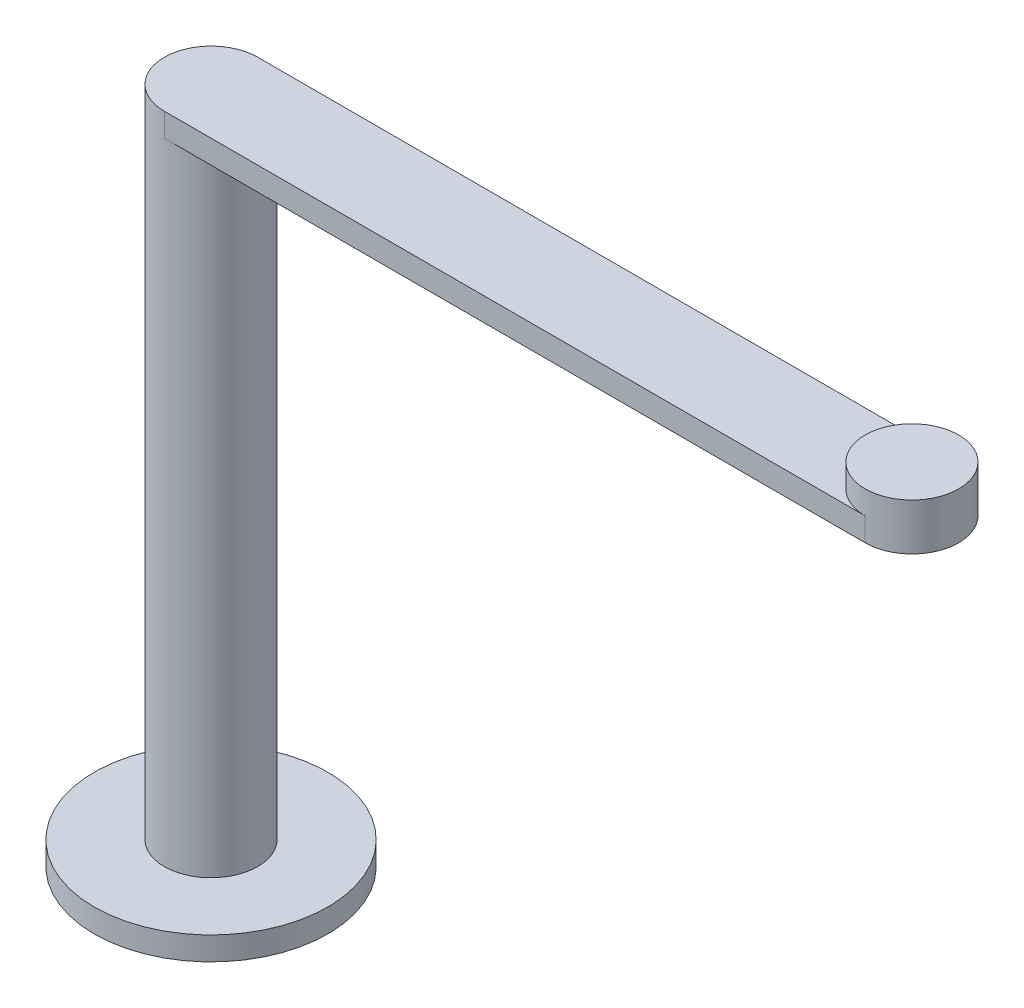
ISO-10303-21;
HEADER;
FILE_DESCRIPTION(('STEP AP214'),'2;1');
FILE_NAME('part.step','',(''),(''),'','','');
FILE_SCHEMA(('AUTOMOTIVE_DESIGN { 1 0 10303 214 1 1 1 1 }'));
ENDSEC;
DATA;
#1=APPLICATION_CONTEXT('core data for automotive mechanical design processes');
#2=APPLICATION_PROTOCOL_DEFINITION('international standard','automotive_design',2000,#1);
#3=PRODUCT_CONTEXT('',#1,'mechanical');
#4=PRODUCT('Part','Part','',(#3));
#5=PRODUCT_RELATED_PRODUCT_CATEGORY('part','',(#4));
#6=PRODUCT_DEFINITION_FORMATION('','',#4);
#7=PRODUCT_DEFINITION_CONTEXT('part definition',#1,'design');
#8=PRODUCT_DEFINITION('design','',#6,#7);
#9=PRODUCT_DEFINITION_SHAPE('','',#8);
#10=(LENGTH_UNIT() NAMED_UNIT(*) SI_UNIT(.MILLI.,.METRE.));
#11=(NAMED_UNIT(*) PLANE_ANGLE_UNIT() SI_UNIT($,.RADIAN.));
#12=(NAMED_UNIT(*) SI_UNIT($,.STERADIAN.) SOLID_ANGLE_UNIT());
#13=UNCERTAINTY_MEASURE_WITH_UNIT(LENGTH_MEASURE(1.E-05),#10,'distance_accuracy_value','');
#14=(GEOMETRIC_REPRESENTATION_CONTEXT(3) GLOBAL_UNCERTAINTY_ASSIGNED_CONTEXT((#13)) GLOBAL_UNIT_ASSIGNED_CONTEXT((#10,
#11,#12)) REPRESENTATION_CONTEXT('',''));
#15=CARTESIAN_POINT('',(0.,0.,0.));
#16=DIRECTION('',(0.,0.,1.));
#17=DIRECTION('',(1.,0.,0.));
#18=AXIS2_PLACEMENT_3D('',#15,#16,#17);
#19=CARTESIAN_POINT('',(0.,10.,0.));
#20=DIRECTION('',(0.,-1.,0.));
#21=DIRECTION('',(0.,0.,-1.));
#22=AXIS2_PLACEMENT_3D('',#19,#20,#21);
#23=CYLINDRICAL_SURFACE('',#22,50.);
#24=CARTESIAN_POINT('',(0.,10.,0.));
#25=DIRECTION('',(0.,1.,0.));
#26=DIRECTION('',(0.,0.,1.));
#27=AXIS2_PLACEMENT_3D('',#24,#25,#26);
#28=CIRCLE('',#27,50.);
#29=CARTESIAN_POINT('',(0.,10.,50.));
#30=VERTEX_POINT('',#29);
#31=EDGE_CURVE('E110',#30,#30,#28,.T.);
#32=ORIENTED_EDGE('',*,*,#31,.F.);
#33=EDGE_LOOP('',(#32));
#34=FACE_BOUND('',#33,.T.);
#35=CARTESIAN_POINT('',(0.,0.,0.));
#36=DIRECTION('',(0.,1.,0.));
#37=DIRECTION('',(0.,0.,1.));
#38=AXIS2_PLACEMENT_3D('',#35,#36,#37);
#39=CIRCLE('',#38,50.);
#40=CARTESIAN_POINT('',(0.,0.,50.));
#41=VERTEX_POINT('',#40);
#42=EDGE_CURVE('E107',#41,#41,#39,.T.);
#43=ORIENTED_EDGE('',*,*,#42,.T.);
#44=EDGE_LOOP('',(#43));
#45=FACE_BOUND('',#44,.T.);
#46=ADVANCED_FACE('F37',(#34,#45),#23,.T.);
#47=CARTESIAN_POINT('',(0.,10.,0.));
#48=DIRECTION('',(0.,1.,0.));
#49=DIRECTION('',(0.,0.,1.));
#50=AXIS2_PLACEMENT_3D('',#47,#48,#49);
#51=PLANE('',#50);
#52=CARTESIAN_POINT('',(0.,10.,0.));
#53=DIRECTION('',(0.,1.,0.));
#54=DIRECTION('',(0.,0.,1.));
#55=AXIS2_PLACEMENT_3D('',#52,#53,#54);
#56=CIRCLE('',#55,20.);
#57=CARTESIAN_POINT('',(0.,10.,20.));
#58=VERTEX_POINT('',#57);
#59=EDGE_CURVE('E44',#58,#58,#56,.T.);
#60=ORIENTED_EDGE('',*,*,#59,.F.);
#61=EDGE_LOOP('',(#60));
#62=FACE_BOUND('',#61,.T.);
#63=ORIENTED_EDGE('',*,*,#31,.T.);
#64=EDGE_LOOP('',(#63));
#65=FACE_BOUND('',#64,.T.);
#66=ADVANCED_FACE('F119',(#62,#65),#51,.T.);
#67=CARTESIAN_POINT('',(0.,0.,0.));
#68=DIRECTION('',(0.,1.,0.));
#69=DIRECTION('',(0.,0.,1.));
#70=AXIS2_PLACEMENT_3D('',#67,#68,#69);
#71=PLANE('',#70);
#72=ORIENTED_EDGE('',*,*,#42,.F.);
#73=EDGE_LOOP('',(#72));
#74=FACE_BOUND('',#73,.T.);
#75=ADVANCED_FACE('F116',(#74),#71,.F.);
#76=CARTESIAN_POINT('',(0.,290.,0.));
#77=DIRECTION('',(0.,-1.,0.));
#78=DIRECTION('',(0.,0.,-1.));
#79=AXIS2_PLACEMENT_3D('',#76,#77,#78);
#80=CYLINDRICAL_SURFACE('',#79,20.);
#81=CARTESIAN_POINT('',(0.,290.,0.));
#82=DIRECTION('',(0.,1.,0.));
#83=DIRECTION('',(0.,0.,1.));
#84=AXIS2_PLACEMENT_3D('',#81,#82,#83);
#85=CIRCLE('',#84,20.);
#86=CARTESIAN_POINT('',(0.,290.,-20.));
#87=VERTEX_POINT('',#86);
#88=CARTESIAN_POINT('',(0.,290.,20.));
#89=VERTEX_POINT('',#88);
#90=EDGE_CURVE('E95',#87,#89,#85,.T.);
#91=ORIENTED_EDGE('',*,*,#90,.F.);
#92=DIRECTION('',(0.,1.,0.));
#93=VECTOR('',#92,1.);
#94=CARTESIAN_POINT('',(0.,280.,-20.));
#95=LINE('',#94,#93);
#96=CARTESIAN_POINT('',(0.,280.,-20.));
#97=VERTEX_POINT('',#96);
#98=EDGE_CURVE('E102',#97,#87,#95,.T.);
#99=ORIENTED_EDGE('',*,*,#98,.F.);
#100=CARTESIAN_POINT('',(0.,280.,0.));
#101=DIRECTION('',(0.,1.,0.));
#102=DIRECTION('',(0.,0.,1.));
#103=AXIS2_PLACEMENT_3D('',#100,#101,#102);
#104=CIRCLE('',#103,20.);
#105=CARTESIAN_POINT('',(0.,280.,20.));
#106=VERTEX_POINT('',#105);
#107=EDGE_CURVE('E11',#106,#97,#104,.T.);
#108=ORIENTED_EDGE('',*,*,#107,.F.);
#109=DIRECTION('',(0.,1.,0.));
#110=VECTOR('',#109,1.);
#111=CARTESIAN_POINT('',(0.,280.,20.));
#112=LINE('',#111,#110);
#113=EDGE_CURVE('E91',#106,#89,#112,.T.);
#114=ORIENTED_EDGE('',*,*,#113,.T.);
#115=EDGE_LOOP('',(#91,#99,#108,#114));
#116=FACE_BOUND('',#115,.T.);
#117=ORIENTED_EDGE('',*,*,#59,.T.);
#118=EDGE_LOOP('',(#117));
#119=FACE_BOUND('',#118,.T.);
#120=ADVANCED_FACE('F118',(#116,#119),#80,.T.);
#121=CARTESIAN_POINT('',(0.,290.,0.));
#122=DIRECTION('',(0.,1.,0.));
#123=DIRECTION('',(0.,0.,1.));
#124=AXIS2_PLACEMENT_3D('',#121,#122,#123);
#125=PLANE('',#124);
#126=CARTESIAN_POINT('',(300.,290.,0.));
#127=DIRECTION('',(0.,1.,0.));
#128=DIRECTION('',(0.,0.,1.));
#129=AXIS2_PLACEMENT_3D('',#126,#127,#128);
#130=CIRCLE('',#129,19.9999999999999);
#131=CARTESIAN_POINT('',(300.,290.,-19.9999999999999));
#132=VERTEX_POINT('',#131);
#133=CARTESIAN_POINT('',(300.,290.,19.9999999999999));
#134=VERTEX_POINT('',#133);
#135=EDGE_CURVE('E72',#132,#134,#130,.T.);
#136=ORIENTED_EDGE('',*,*,#135,.F.);
#137=DIRECTION('',(-1.,0.,0.));
#138=VECTOR('',#137,1.);
#139=CARTESIAN_POINT('',(0.,290.,-20.));
#140=LINE('',#139,#138);
#141=EDGE_CURVE('E51',#132,#87,#140,.T.);
#142=ORIENTED_EDGE('',*,*,#141,.T.);
#143=ORIENTED_EDGE('',*,*,#90,.T.);
#144=DIRECTION('',(1.,0.,0.));
#145=VECTOR('',#144,1.);
#146=CARTESIAN_POINT('',(0.,290.,20.));
#147=LINE('',#146,#145);
#148=EDGE_CURVE('E83',#89,#134,#147,.T.);
#149=ORIENTED_EDGE('',*,*,#148,.T.);
#150=EDGE_LOOP('',(#136,#142,#143,#149));
#151=FACE_BOUND('',#150,.T.);
#152=ADVANCED_FACE('F93',(#151),#125,.T.);
#153=CARTESIAN_POINT('',(0.,280.,0.));
#154=DIRECTION('',(0.,1.,0.));
#155=DIRECTION('',(0.,0.,1.));
#156=AXIS2_PLACEMENT_3D('',#153,#154,#155);
#157=PLANE('',#156);
#158=DIRECTION('',(-1.,0.,0.));
#159=VECTOR('',#158,1.);
#160=CARTESIAN_POINT('',(0.,280.,-20.));
#161=LINE('',#160,#159);
#162=CARTESIAN_POINT('',(300.,280.,-19.9999999999999));
#163=VERTEX_POINT('',#162);
#164=EDGE_CURVE('E99',#163,#97,#161,.T.);
#165=ORIENTED_EDGE('',*,*,#164,.F.);
#166=CARTESIAN_POINT('',(300.,280.,0.));
#167=DIRECTION('',(0.,1.,0.));
#168=DIRECTION('',(0.,0.,1.));
#169=AXIS2_PLACEMENT_3D('',#166,#167,#168);
#170=CIRCLE('',#169,19.9999999999999);
#171=CARTESIAN_POINT('',(300.,280.,19.9999999999999));
#172=VERTEX_POINT('',#171);
#173=EDGE_CURVE('E84',#172,#163,#170,.T.);
#174=ORIENTED_EDGE('',*,*,#173,.F.);
#175=DIRECTION('',(1.,0.,0.));
#176=VECTOR('',#175,1.);
#177=CARTESIAN_POINT('',(0.,280.,20.));
#178=LINE('',#177,#176);
#179=EDGE_CURVE('E90',#106,#172,#178,.T.);
#180=ORIENTED_EDGE('',*,*,#179,.F.);
#181=ORIENTED_EDGE('',*,*,#107,.T.);
#182=EDGE_LOOP('',(#165,#174,#180,#181));
#183=FACE_BOUND('',#182,.T.);
#184=ADVANCED_FACE('F156',(#183),#157,.F.);
#185=CARTESIAN_POINT('',(0.,280.,-20.));
#186=DIRECTION('',(0.,0.,-1.));
#187=DIRECTION('',(-1.,0.,0.));
#188=AXIS2_PLACEMENT_3D('',#185,#186,#187);
#189=PLANE('',#188);
#190=ORIENTED_EDGE('',*,*,#141,.F.);
#191=DIRECTION('',(0.,1.,0.));
#192=VECTOR('',#191,1.);
#193=CARTESIAN_POINT('',(300.,280.,-19.9999999999999));
#194=LINE('',#193,#192);
#195=EDGE_CURVE('E81',#163,#132,#194,.T.);
#196=ORIENTED_EDGE('',*,*,#195,.F.);
#197=ORIENTED_EDGE('',*,*,#164,.T.);
#198=ORIENTED_EDGE('',*,*,#98,.T.);
#199=EDGE_LOOP('',(#190,#196,#197,#198));
#200=FACE_BOUND('',#199,.T.);
#201=ADVANCED_FACE('F166',(#200),#189,.T.);
#202=CARTESIAN_POINT('',(0.,280.,20.));
#203=DIRECTION('',(0.,0.,1.));
#204=DIRECTION('',(1.,0.,0.));
#205=AXIS2_PLACEMENT_3D('',#202,#203,#204);
#206=PLANE('',#205);
#207=ORIENTED_EDGE('',*,*,#148,.F.);
#208=ORIENTED_EDGE('',*,*,#113,.F.);
#209=ORIENTED_EDGE('',*,*,#179,.T.);
#210=DIRECTION('',(0.,1.,0.));
#211=VECTOR('',#210,1.);
#212=CARTESIAN_POINT('',(300.,280.,19.9999999999999));
#213=LINE('',#212,#211);
#214=EDGE_CURVE('E78',#172,#134,#213,.T.);
#215=ORIENTED_EDGE('',*,*,#214,.T.);
#216=EDGE_LOOP('',(#207,#208,#209,#215));
#217=FACE_BOUND('',#216,.T.);
#218=ADVANCED_FACE('F88',(#217),#206,.T.);
#219=CARTESIAN_POINT('',(300.,280.,0.));
#220=DIRECTION('',(0.,1.,0.));
#221=DIRECTION('',(0.,0.,1.));
#222=AXIS2_PLACEMENT_3D('',#219,#220,#221);
#223=CYLINDRICAL_SURFACE('',#222,19.9999999999999);
#224=ORIENTED_EDGE('',*,*,#173,.T.);
#225=ORIENTED_EDGE('',*,*,#195,.T.);
#226=ORIENTED_EDGE('',*,*,#135,.T.);
#227=ORIENTED_EDGE('',*,*,#214,.F.);
#228=EDGE_LOOP('',(#224,#225,#226,#227));
#229=FACE_BOUND('',#228,.T.);
#230=CARTESIAN_POINT('',(300.,300.,0.));
#231=DIRECTION('',(0.,1.,0.));
#232=DIRECTION('',(0.,0.,1.));
#233=AXIS2_PLACEMENT_3D('',#230,#231,#232);
#234=CIRCLE('',#233,19.9999999999999);
#235=CARTESIAN_POINT('',(300.,300.,19.9999999999999));
#236=VERTEX_POINT('',#235);
#237=EDGE_CURVE('E207',#236,#236,#234,.T.);
#238=ORIENTED_EDGE('',*,*,#237,.F.);
#239=EDGE_LOOP('',(#238));
#240=FACE_BOUND('',#239,.T.);
#241=ADVANCED_FACE('F75',(#229,#240),#223,.T.);
#242=CARTESIAN_POINT('',(300.,300.,0.));
#243=DIRECTION('',(0.,1.,0.));
#244=DIRECTION('',(0.,0.,1.));
#245=AXIS2_PLACEMENT_3D('',#242,#243,#244);
#246=PLANE('',#245);
#247=ORIENTED_EDGE('',*,*,#237,.T.);
#248=EDGE_LOOP('',(#247));
#249=FACE_BOUND('',#248,.T.);
#250=ADVANCED_FACE('F192',(#249),#246,.T.);
#251=CLOSED_SHELL('',(#46,#66,#75,#120,#152,#184,#201,#218,#241,#250));
#252=MANIFOLD_SOLID_BREP('B2',#251);
#253=ADVANCED_BREP_SHAPE_REPRESENTATION('',(#18,#252),#14);
#254=SHAPE_DEFINITION_REPRESENTATION(#9,#253);
ENDSEC;
END-ISO-10303-21;
